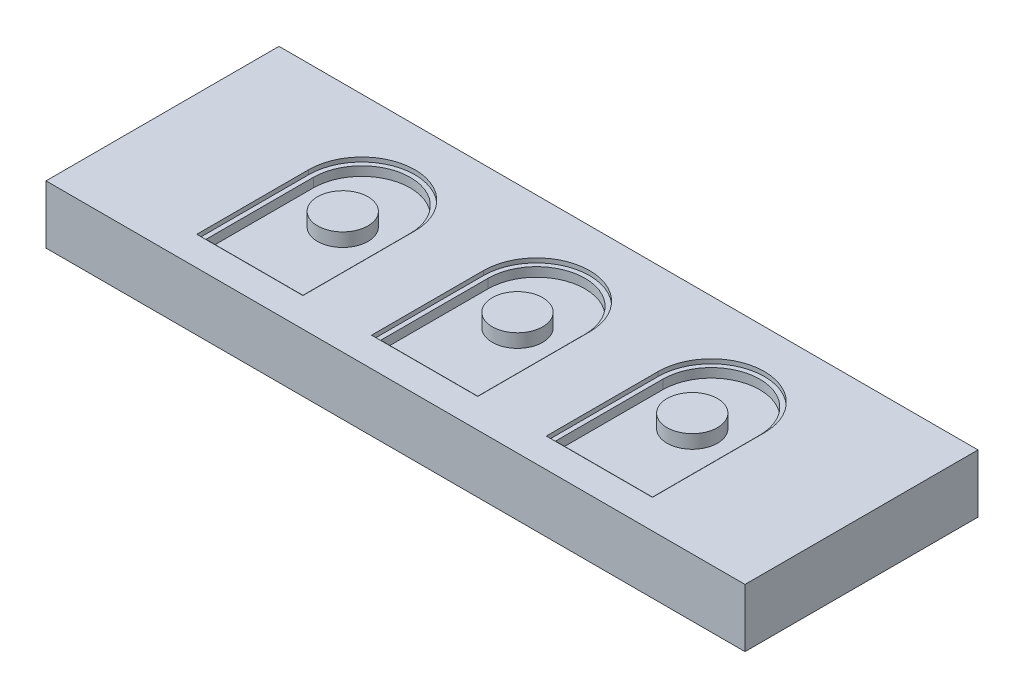
ISO-10303-21;
HEADER;
FILE_DESCRIPTION(('STEP AP214'),'2;1');
FILE_NAME('part.step','',(''),(''),'','','');
FILE_SCHEMA(('AUTOMOTIVE_DESIGN { 1 0 10303 214 1 1 1 1 }'));
ENDSEC;
DATA;
#1=APPLICATION_CONTEXT('core data for automotive mechanical design processes');
#2=APPLICATION_PROTOCOL_DEFINITION('international standard','automotive_design',2000,#1);
#3=PRODUCT_CONTEXT('',#1,'mechanical');
#4=PRODUCT('Part','Part','',(#3));
#5=PRODUCT_RELATED_PRODUCT_CATEGORY('part','',(#4));
#6=PRODUCT_DEFINITION_FORMATION('','',#4);
#7=PRODUCT_DEFINITION_CONTEXT('part definition',#1,'design');
#8=PRODUCT_DEFINITION('design','',#6,#7);
#9=PRODUCT_DEFINITION_SHAPE('','',#8);
#10=(LENGTH_UNIT() NAMED_UNIT(*) SI_UNIT(.MILLI.,.METRE.));
#11=(NAMED_UNIT(*) PLANE_ANGLE_UNIT() SI_UNIT($,.RADIAN.));
#12=(NAMED_UNIT(*) SI_UNIT($,.STERADIAN.) SOLID_ANGLE_UNIT());
#13=UNCERTAINTY_MEASURE_WITH_UNIT(LENGTH_MEASURE(1.E-05),#10,'distance_accuracy_value','');
#14=(GEOMETRIC_REPRESENTATION_CONTEXT(3) GLOBAL_UNCERTAINTY_ASSIGNED_CONTEXT((#13)) GLOBAL_UNIT_ASSIGNED_CONTEXT((#10,
#11,#12)) REPRESENTATION_CONTEXT('',''));
#15=CARTESIAN_POINT('',(0.,0.,0.));
#16=DIRECTION('',(0.,0.,1.));
#17=DIRECTION('',(1.,0.,0.));
#18=AXIS2_PLACEMENT_3D('',#15,#16,#17);
#19=CARTESIAN_POINT('',(0.,12.7,0.));
#20=DIRECTION('',(1.,0.,0.));
#21=DIRECTION('',(0.,0.,-1.));
#22=AXIS2_PLACEMENT_3D('',#19,#20,#21);
#23=PLANE('',#22);
#24=DIRECTION('',(0.,0.,1.));
#25=VECTOR('',#24,1.);
#26=CARTESIAN_POINT('',(0.,0.,0.));
#27=LINE('',#26,#25);
#28=CARTESIAN_POINT('',(0.,0.,-50.8));
#29=VERTEX_POINT('',#28);
#30=CARTESIAN_POINT('',(0.,0.,0.));
#31=VERTEX_POINT('',#30);
#32=EDGE_CURVE('E598',#29,#31,#27,.T.);
#33=ORIENTED_EDGE('',*,*,#32,.T.);
#34=DIRECTION('',(0.,-1.,0.));
#35=VECTOR('',#34,1.);
#36=CARTESIAN_POINT('',(0.,12.7,0.));
#37=LINE('',#36,#35);
#38=CARTESIAN_POINT('',(0.,12.7,0.));
#39=VERTEX_POINT('',#38);
#40=EDGE_CURVE('E12',#39,#31,#37,.T.);
#41=ORIENTED_EDGE('',*,*,#40,.F.);
#42=DIRECTION('',(0.,0.,1.));
#43=VECTOR('',#42,1.);
#44=CARTESIAN_POINT('',(0.,12.7,0.));
#45=LINE('',#44,#43);
#46=CARTESIAN_POINT('',(0.,12.7,-50.8));
#47=VERTEX_POINT('',#46);
#48=EDGE_CURVE('E612',#47,#39,#45,.T.);
#49=ORIENTED_EDGE('',*,*,#48,.F.);
#50=DIRECTION('',(0.,-1.,0.));
#51=VECTOR('',#50,1.);
#52=CARTESIAN_POINT('',(0.,12.7,-50.8));
#53=LINE('',#52,#51);
#54=EDGE_CURVE('E626',#47,#29,#53,.T.);
#55=ORIENTED_EDGE('',*,*,#54,.T.);
#56=EDGE_LOOP('',(#33,#41,#49,#55));
#57=FACE_BOUND('',#56,.T.);
#58=ADVANCED_FACE('F48',(#57),#23,.F.);
#59=CARTESIAN_POINT('',(0.,12.7,0.));
#60=DIRECTION('',(0.,0.,-1.));
#61=DIRECTION('',(-1.,0.,0.));
#62=AXIS2_PLACEMENT_3D('',#59,#60,#61);
#63=PLANE('',#62);
#64=DIRECTION('',(1.,0.,0.));
#65=VECTOR('',#64,1.);
#66=CARTESIAN_POINT('',(0.,0.,0.));
#67=LINE('',#66,#65);
#68=CARTESIAN_POINT('',(152.4,0.,0.));
#69=VERTEX_POINT('',#68);
#70=EDGE_CURVE('E630',#31,#69,#67,.T.);
#71=ORIENTED_EDGE('',*,*,#70,.T.);
#72=DIRECTION('',(0.,-1.,0.));
#73=VECTOR('',#72,1.);
#74=CARTESIAN_POINT('',(152.4,12.7,0.));
#75=LINE('',#74,#73);
#76=CARTESIAN_POINT('',(152.4,12.7,0.));
#77=VERTEX_POINT('',#76);
#78=EDGE_CURVE('E56',#77,#69,#75,.T.);
#79=ORIENTED_EDGE('',*,*,#78,.F.);
#80=DIRECTION('',(1.,0.,0.));
#81=VECTOR('',#80,1.);
#82=CARTESIAN_POINT('',(0.,12.7,0.));
#83=LINE('',#82,#81);
#84=EDGE_CURVE('E616',#39,#77,#83,.T.);
#85=ORIENTED_EDGE('',*,*,#84,.F.);
#86=ORIENTED_EDGE('',*,*,#40,.T.);
#87=EDGE_LOOP('',(#71,#79,#85,#86));
#88=FACE_BOUND('',#87,.T.);
#89=ADVANCED_FACE('F666',(#88),#63,.F.);
#90=CARTESIAN_POINT('',(152.4,12.7,0.));
#91=DIRECTION('',(-1.,0.,0.));
#92=DIRECTION('',(0.,0.,1.));
#93=AXIS2_PLACEMENT_3D('',#90,#91,#92);
#94=PLANE('',#93);
#95=DIRECTION('',(0.,0.,-1.));
#96=VECTOR('',#95,1.);
#97=CARTESIAN_POINT('',(152.4,0.,0.));
#98=LINE('',#97,#96);
#99=CARTESIAN_POINT('',(152.4,0.,-50.8));
#100=VERTEX_POINT('',#99);
#101=EDGE_CURVE('E633',#69,#100,#98,.T.);
#102=ORIENTED_EDGE('',*,*,#101,.T.);
#103=DIRECTION('',(0.,-1.,0.));
#104=VECTOR('',#103,1.);
#105=CARTESIAN_POINT('',(152.4,12.7,-50.8));
#106=LINE('',#105,#104);
#107=CARTESIAN_POINT('',(152.4,12.7,-50.8));
#108=VERTEX_POINT('',#107);
#109=EDGE_CURVE('E641',#108,#100,#106,.T.);
#110=ORIENTED_EDGE('',*,*,#109,.F.);
#111=DIRECTION('',(0.,0.,-1.));
#112=VECTOR('',#111,1.);
#113=CARTESIAN_POINT('',(152.4,12.7,0.));
#114=LINE('',#113,#112);
#115=EDGE_CURVE('E620',#77,#108,#114,.T.);
#116=ORIENTED_EDGE('',*,*,#115,.F.);
#117=ORIENTED_EDGE('',*,*,#78,.T.);
#118=EDGE_LOOP('',(#102,#110,#116,#117));
#119=FACE_BOUND('',#118,.T.);
#120=ADVANCED_FACE('F650',(#119),#94,.F.);
#121=CARTESIAN_POINT('',(0.,12.7,-50.8));
#122=DIRECTION('',(0.,0.,1.));
#123=DIRECTION('',(1.,0.,0.));
#124=AXIS2_PLACEMENT_3D('',#121,#122,#123);
#125=PLANE('',#124);
#126=DIRECTION('',(-1.,0.,0.));
#127=VECTOR('',#126,1.);
#128=CARTESIAN_POINT('',(0.,0.,-50.8));
#129=LINE('',#128,#127);
#130=EDGE_CURVE('E617',#100,#29,#129,.T.);
#131=ORIENTED_EDGE('',*,*,#130,.T.);
#132=ORIENTED_EDGE('',*,*,#54,.F.);
#133=DIRECTION('',(-1.,0.,0.));
#134=VECTOR('',#133,1.);
#135=CARTESIAN_POINT('',(0.,12.7,-50.8));
#136=LINE('',#135,#134);
#137=EDGE_CURVE('E623',#108,#47,#136,.T.);
#138=ORIENTED_EDGE('',*,*,#137,.F.);
#139=ORIENTED_EDGE('',*,*,#109,.T.);
#140=EDGE_LOOP('',(#131,#132,#138,#139));
#141=FACE_BOUND('',#140,.T.);
#142=ADVANCED_FACE('F659',(#141),#125,.F.);
#143=CARTESIAN_POINT('',(0.,12.7,0.));
#144=DIRECTION('',(0.,-1.,0.));
#145=DIRECTION('',(0.,0.,-1.));
#146=AXIS2_PLACEMENT_3D('',#143,#144,#145);
#147=PLANE('',#146);
#148=DIRECTION('',(0.,0.,1.));
#149=VECTOR('',#148,1.);
#150=CARTESIAN_POINT('',(26.526998,12.7,-30.75));
#151=LINE('',#150,#149);
#152=CARTESIAN_POINT('',(26.526998,12.7,-30.75));
#153=VERTEX_POINT('',#152);
#154=CARTESIAN_POINT('',(26.526998,12.7,-6.35));
#155=VERTEX_POINT('',#154);
#156=EDGE_CURVE('E405',#153,#155,#151,.T.);
#157=ORIENTED_EDGE('',*,*,#156,.F.);
#158=CARTESIAN_POINT('',(38.1,12.7,-30.75));
#159=DIRECTION('',(0.,1.,0.));
#160=DIRECTION('',(0.,0.,1.));
#161=AXIS2_PLACEMENT_3D('',#158,#159,#160);
#162=CIRCLE('',#161,11.573002);
#163=CARTESIAN_POINT('',(49.673002,12.7,-30.75));
#164=VERTEX_POINT('',#163);
#165=EDGE_CURVE('E402',#164,#153,#162,.T.);
#166=ORIENTED_EDGE('',*,*,#165,.F.);
#167=DIRECTION('',(0.,0.,-1.));
#168=VECTOR('',#167,1.);
#169=CARTESIAN_POINT('',(49.673002,12.7,-6.35));
#170=LINE('',#169,#168);
#171=CARTESIAN_POINT('',(49.673002,12.7,-6.35));
#172=VERTEX_POINT('',#171);
#173=EDGE_CURVE('E383',#172,#164,#170,.T.);
#174=ORIENTED_EDGE('',*,*,#173,.F.);
#175=DIRECTION('',(1.,0.,0.));
#176=VECTOR('',#175,1.);
#177=CARTESIAN_POINT('',(26.526998,12.7,-6.35));
#178=LINE('',#177,#176);
#179=EDGE_CURVE('E419',#155,#172,#178,.T.);
#180=ORIENTED_EDGE('',*,*,#179,.F.);
#181=EDGE_LOOP('',(#157,#166,#174,#180));
#182=FACE_BOUND('',#181,.T.);
#183=DIRECTION('',(0.,0.,1.));
#184=VECTOR('',#183,1.);
#185=CARTESIAN_POINT('',(102.726998,12.7,-30.75));
#186=LINE('',#185,#184);
#187=CARTESIAN_POINT('',(102.726998,12.7,-30.75));
#188=VERTEX_POINT('',#187);
#189=CARTESIAN_POINT('',(102.726998,12.7,-6.35));
#190=VERTEX_POINT('',#189);
#191=EDGE_CURVE('E469',#188,#190,#186,.T.);
#192=ORIENTED_EDGE('',*,*,#191,.F.);
#193=CARTESIAN_POINT('',(114.3,12.7,-30.75));
#194=DIRECTION('',(0.,1.,0.));
#195=DIRECTION('',(0.,0.,1.));
#196=AXIS2_PLACEMENT_3D('',#193,#194,#195);
#197=CIRCLE('',#196,11.573002);
#198=CARTESIAN_POINT('',(125.873002,12.7,-30.75));
#199=VERTEX_POINT('',#198);
#200=EDGE_CURVE('E303',#199,#188,#197,.T.);
#201=ORIENTED_EDGE('',*,*,#200,.F.);
#202=DIRECTION('',(0.,0.,-1.));
#203=VECTOR('',#202,1.);
#204=CARTESIAN_POINT('',(125.873002,12.7,-6.35));
#205=LINE('',#204,#203);
#206=CARTESIAN_POINT('',(125.873002,12.7,-6.35));
#207=VERTEX_POINT('',#206);
#208=EDGE_CURVE('E448',#207,#199,#205,.T.);
#209=ORIENTED_EDGE('',*,*,#208,.F.);
#210=DIRECTION('',(1.,0.,0.));
#211=VECTOR('',#210,1.);
#212=CARTESIAN_POINT('',(102.726998,12.7,-6.35));
#213=LINE('',#212,#211);
#214=EDGE_CURVE('E481',#190,#207,#213,.T.);
#215=ORIENTED_EDGE('',*,*,#214,.F.);
#216=EDGE_LOOP('',(#192,#201,#209,#215));
#217=FACE_BOUND('',#216,.T.);
#218=DIRECTION('',(0.,0.,1.));
#219=VECTOR('',#218,1.);
#220=CARTESIAN_POINT('',(64.626998,12.7,-30.75));
#221=LINE('',#220,#219);
#222=CARTESIAN_POINT('',(64.626998,12.7,-30.75));
#223=VERTEX_POINT('',#222);
#224=CARTESIAN_POINT('',(64.626998,12.7,-6.35));
#225=VERTEX_POINT('',#224);
#226=EDGE_CURVE('E582',#223,#225,#221,.T.);
#227=ORIENTED_EDGE('',*,*,#226,.F.);
#228=CARTESIAN_POINT('',(76.2,12.7,-30.75));
#229=DIRECTION('',(0.,1.,0.));
#230=DIRECTION('',(0.,0.,1.));
#231=AXIS2_PLACEMENT_3D('',#228,#229,#230);
#232=CIRCLE('',#231,11.573002);
#233=CARTESIAN_POINT('',(87.773002,12.7,-30.75));
#234=VERTEX_POINT('',#233);
#235=EDGE_CURVE('E546',#234,#223,#232,.T.);
#236=ORIENTED_EDGE('',*,*,#235,.F.);
#237=DIRECTION('',(0.,0.,-1.));
#238=VECTOR('',#237,1.);
#239=CARTESIAN_POINT('',(87.773002,12.7,-6.35));
#240=LINE('',#239,#238);
#241=CARTESIAN_POINT('',(87.773002,12.7,-6.35));
#242=VERTEX_POINT('',#241);
#243=EDGE_CURVE('E563',#242,#234,#240,.T.);
#244=ORIENTED_EDGE('',*,*,#243,.F.);
#245=DIRECTION('',(1.,0.,0.));
#246=VECTOR('',#245,1.);
#247=CARTESIAN_POINT('',(64.626998,12.7,-6.35));
#248=LINE('',#247,#246);
#249=EDGE_CURVE('E592',#225,#242,#248,.T.);
#250=ORIENTED_EDGE('',*,*,#249,.F.);
#251=EDGE_LOOP('',(#227,#236,#244,#250));
#252=FACE_BOUND('',#251,.T.);
#253=ORIENTED_EDGE('',*,*,#48,.T.);
#254=ORIENTED_EDGE('',*,*,#84,.T.);
#255=ORIENTED_EDGE('',*,*,#115,.T.);
#256=ORIENTED_EDGE('',*,*,#137,.T.);
#257=EDGE_LOOP('',(#253,#254,#255,#256));
#258=FACE_BOUND('',#257,.T.);
#259=ADVANCED_FACE('F665',(#182,#217,#252,#258),#147,.F.);
#260=CARTESIAN_POINT('',(0.,0.,0.));
#261=DIRECTION('',(0.,-1.,0.));
#262=DIRECTION('',(0.,0.,-1.));
#263=AXIS2_PLACEMENT_3D('',#260,#261,#262);
#264=PLANE('',#263);
#265=ORIENTED_EDGE('',*,*,#32,.F.);
#266=ORIENTED_EDGE('',*,*,#130,.F.);
#267=ORIENTED_EDGE('',*,*,#101,.F.);
#268=ORIENTED_EDGE('',*,*,#70,.F.);
#269=EDGE_LOOP('',(#265,#266,#267,#268));
#270=FACE_BOUND('',#269,.T.);
#271=ADVANCED_FACE('F656',(#270),#264,.T.);
#272=CARTESIAN_POINT('',(76.2,11.75,-30.75));
#273=DIRECTION('',(0.,1.,0.));
#274=DIRECTION('',(0.,0.,1.));
#275=AXIS2_PLACEMENT_3D('',#272,#273,#274);
#276=CYLINDRICAL_SURFACE('',#275,11.573002);
#277=ORIENTED_EDGE('',*,*,#235,.T.);
#278=DIRECTION('',(0.,1.,0.));
#279=VECTOR('',#278,1.);
#280=CARTESIAN_POINT('',(64.626998,11.75,-30.75));
#281=LINE('',#280,#279);
#282=CARTESIAN_POINT('',(64.626998,11.75,-30.75));
#283=VERTEX_POINT('',#282);
#284=EDGE_CURVE('E577',#283,#223,#281,.T.);
#285=ORIENTED_EDGE('',*,*,#284,.F.);
#286=CARTESIAN_POINT('',(76.2,11.75,-30.75));
#287=DIRECTION('',(0.,1.,0.));
#288=DIRECTION('',(0.,0.,1.));
#289=AXIS2_PLACEMENT_3D('',#286,#287,#288);
#290=CIRCLE('',#289,11.573002);
#291=CARTESIAN_POINT('',(87.773002,11.75,-30.75));
#292=VERTEX_POINT('',#291);
#293=EDGE_CURVE('E558',#292,#283,#290,.T.);
#294=ORIENTED_EDGE('',*,*,#293,.F.);
#295=DIRECTION('',(0.,1.,0.));
#296=VECTOR('',#295,1.);
#297=CARTESIAN_POINT('',(87.773002,11.75,-30.75));
#298=LINE('',#297,#296);
#299=EDGE_CURVE('E594',#292,#234,#298,.T.);
#300=ORIENTED_EDGE('',*,*,#299,.T.);
#301=EDGE_LOOP('',(#277,#285,#294,#300));
#302=FACE_BOUND('',#301,.T.);
#303=ADVANCED_FACE('F678',(#302),#276,.F.);
#304=CARTESIAN_POINT('',(87.773002,11.75,-6.35));
#305=DIRECTION('',(1.,0.,0.));
#306=DIRECTION('',(0.,0.,-1.));
#307=AXIS2_PLACEMENT_3D('',#304,#305,#306);
#308=PLANE('',#307);
#309=ORIENTED_EDGE('',*,*,#243,.T.);
#310=ORIENTED_EDGE('',*,*,#299,.F.);
#311=DIRECTION('',(0.,0.,-1.));
#312=VECTOR('',#311,1.);
#313=CARTESIAN_POINT('',(87.773002,11.75,-6.35));
#314=LINE('',#313,#312);
#315=CARTESIAN_POINT('',(87.773002,11.75,-6.35));
#316=VERTEX_POINT('',#315);
#317=EDGE_CURVE('E572',#316,#292,#314,.T.);
#318=ORIENTED_EDGE('',*,*,#317,.F.);
#319=DIRECTION('',(0.,1.,0.));
#320=VECTOR('',#319,1.);
#321=CARTESIAN_POINT('',(87.773002,11.75,-6.35));
#322=LINE('',#321,#320);
#323=EDGE_CURVE('E599',#316,#242,#322,.T.);
#324=ORIENTED_EDGE('',*,*,#323,.T.);
#325=EDGE_LOOP('',(#309,#310,#318,#324));
#326=FACE_BOUND('',#325,.T.);
#327=ADVANCED_FACE('F684',(#326),#308,.F.);
#328=CARTESIAN_POINT('',(64.626998,11.75,-6.35));
#329=DIRECTION('',(0.,0.,1.));
#330=DIRECTION('',(1.,0.,0.));
#331=AXIS2_PLACEMENT_3D('',#328,#329,#330);
#332=PLANE('',#331);
#333=ORIENTED_EDGE('',*,*,#249,.T.);
#334=ORIENTED_EDGE('',*,*,#323,.F.);
#335=DIRECTION('',(1.,0.,0.));
#336=VECTOR('',#335,1.);
#337=CARTESIAN_POINT('',(64.626998,11.75,-6.35));
#338=LINE('',#337,#336);
#339=CARTESIAN_POINT('',(64.626998,11.75,-6.35));
#340=VERTEX_POINT('',#339);
#341=EDGE_CURVE('E578',#340,#316,#338,.T.);
#342=ORIENTED_EDGE('',*,*,#341,.F.);
#343=DIRECTION('',(0.,1.,0.));
#344=VECTOR('',#343,1.);
#345=CARTESIAN_POINT('',(64.626998,11.75,-6.35));
#346=LINE('',#345,#344);
#347=EDGE_CURVE('E605',#340,#225,#346,.T.);
#348=ORIENTED_EDGE('',*,*,#347,.T.);
#349=EDGE_LOOP('',(#333,#334,#342,#348));
#350=FACE_BOUND('',#349,.T.);
#351=ADVANCED_FACE('F690',(#350),#332,.F.);
#352=CARTESIAN_POINT('',(64.626998,11.75,-30.75));
#353=DIRECTION('',(-1.,0.,0.));
#354=DIRECTION('',(0.,0.,1.));
#355=AXIS2_PLACEMENT_3D('',#352,#353,#354);
#356=PLANE('',#355);
#357=ORIENTED_EDGE('',*,*,#226,.T.);
#358=ORIENTED_EDGE('',*,*,#347,.F.);
#359=DIRECTION('',(0.,0.,1.));
#360=VECTOR('',#359,1.);
#361=CARTESIAN_POINT('',(64.626998,11.75,-30.75));
#362=LINE('',#361,#360);
#363=EDGE_CURVE('E562',#283,#340,#362,.T.);
#364=ORIENTED_EDGE('',*,*,#363,.F.);
#365=ORIENTED_EDGE('',*,*,#284,.T.);
#366=EDGE_LOOP('',(#357,#358,#364,#365));
#367=FACE_BOUND('',#366,.T.);
#368=ADVANCED_FACE('F686',(#367),#356,.F.);
#369=CARTESIAN_POINT('',(76.2,11.75,-30.75));
#370=DIRECTION('',(0.,1.,0.));
#371=DIRECTION('',(0.,0.,1.));
#372=AXIS2_PLACEMENT_3D('',#369,#370,#371);
#373=PLANE('',#372);
#374=CARTESIAN_POINT('',(76.2,11.75,-30.75));
#375=DIRECTION('',(0.,1.,0.));
#376=DIRECTION('',(0.,0.,1.));
#377=AXIS2_PLACEMENT_3D('',#374,#375,#376);
#378=CIRCLE('',#377,10.573002);
#379=CARTESIAN_POINT('',(86.773002,11.75,-30.75));
#380=VERTEX_POINT('',#379);
#381=CARTESIAN_POINT('',(65.626998,11.75,-30.75));
#382=VERTEX_POINT('',#381);
#383=EDGE_CURVE('E425',#380,#382,#378,.T.);
#384=ORIENTED_EDGE('',*,*,#383,.F.);
#385=DIRECTION('',(0.,0.,-1.));
#386=VECTOR('',#385,1.);
#387=CARTESIAN_POINT('',(86.773002,11.75,-7.35));
#388=LINE('',#387,#386);
#389=CARTESIAN_POINT('',(86.773002,11.75,-7.35));
#390=VERTEX_POINT('',#389);
#391=EDGE_CURVE('E507',#390,#380,#388,.T.);
#392=ORIENTED_EDGE('',*,*,#391,.F.);
#393=DIRECTION('',(1.,0.,0.));
#394=VECTOR('',#393,1.);
#395=CARTESIAN_POINT('',(65.626998,11.75,-7.35));
#396=LINE('',#395,#394);
#397=CARTESIAN_POINT('',(65.626998,11.75,-7.35));
#398=VERTEX_POINT('',#397);
#399=EDGE_CURVE('E541',#398,#390,#396,.T.);
#400=ORIENTED_EDGE('',*,*,#399,.F.);
#401=DIRECTION('',(0.,0.,1.));
#402=VECTOR('',#401,1.);
#403=CARTESIAN_POINT('',(65.626998,11.75,-30.75));
#404=LINE('',#403,#402);
#405=EDGE_CURVE('E529',#382,#398,#404,.T.);
#406=ORIENTED_EDGE('',*,*,#405,.F.);
#407=EDGE_LOOP('',(#384,#392,#400,#406));
#408=FACE_BOUND('',#407,.T.);
#409=ORIENTED_EDGE('',*,*,#293,.T.);
#410=ORIENTED_EDGE('',*,*,#363,.T.);
#411=ORIENTED_EDGE('',*,*,#341,.T.);
#412=ORIENTED_EDGE('',*,*,#317,.T.);
#413=EDGE_LOOP('',(#409,#410,#411,#412));
#414=FACE_BOUND('',#413,.T.);
#415=ADVANCED_FACE('F689',(#408,#414),#373,.T.);
#416=CARTESIAN_POINT('',(76.2,9.75,-30.75));
#417=DIRECTION('',(0.,1.,0.));
#418=DIRECTION('',(0.,0.,1.));
#419=AXIS2_PLACEMENT_3D('',#416,#417,#418);
#420=CYLINDRICAL_SURFACE('',#419,10.573002);
#421=ORIENTED_EDGE('',*,*,#383,.T.);
#422=DIRECTION('',(0.,1.,0.));
#423=VECTOR('',#422,1.);
#424=CARTESIAN_POINT('',(65.626998,9.75,-30.75));
#425=LINE('',#424,#423);
#426=CARTESIAN_POINT('',(65.626998,9.75,-30.75));
#427=VERTEX_POINT('',#426);
#428=EDGE_CURVE('E523',#427,#382,#425,.T.);
#429=ORIENTED_EDGE('',*,*,#428,.F.);
#430=CARTESIAN_POINT('',(76.2,9.75,-30.75));
#431=DIRECTION('',(0.,1.,0.));
#432=DIRECTION('',(0.,0.,1.));
#433=AXIS2_PLACEMENT_3D('',#430,#431,#432);
#434=CIRCLE('',#433,10.573002);
#435=CARTESIAN_POINT('',(86.773002,9.75,-30.75));
#436=VERTEX_POINT('',#435);
#437=EDGE_CURVE('E501',#436,#427,#434,.T.);
#438=ORIENTED_EDGE('',*,*,#437,.F.);
#439=DIRECTION('',(0.,1.,0.));
#440=VECTOR('',#439,1.);
#441=CARTESIAN_POINT('',(86.773002,9.75,-30.75));
#442=LINE('',#441,#440);
#443=EDGE_CURVE('E543',#436,#380,#442,.T.);
#444=ORIENTED_EDGE('',*,*,#443,.T.);
#445=EDGE_LOOP('',(#421,#429,#438,#444));
#446=FACE_BOUND('',#445,.T.);
#447=ADVANCED_FACE('F700',(#446),#420,.F.);
#448=CARTESIAN_POINT('',(86.773002,9.75,-7.35));
#449=DIRECTION('',(1.,0.,0.));
#450=DIRECTION('',(0.,0.,-1.));
#451=AXIS2_PLACEMENT_3D('',#448,#449,#450);
#452=PLANE('',#451);
#453=ORIENTED_EDGE('',*,*,#391,.T.);
#454=ORIENTED_EDGE('',*,*,#443,.F.);
#455=DIRECTION('',(0.,0.,-1.));
#456=VECTOR('',#455,1.);
#457=CARTESIAN_POINT('',(86.773002,9.75,-7.35));
#458=LINE('',#457,#456);
#459=CARTESIAN_POINT('',(86.773002,9.75,-7.35));
#460=VERTEX_POINT('',#459);
#461=EDGE_CURVE('E518',#460,#436,#458,.T.);
#462=ORIENTED_EDGE('',*,*,#461,.F.);
#463=DIRECTION('',(0.,1.,0.));
#464=VECTOR('',#463,1.);
#465=CARTESIAN_POINT('',(86.773002,9.75,-7.35));
#466=LINE('',#465,#464);
#467=EDGE_CURVE('E547',#460,#390,#466,.T.);
#468=ORIENTED_EDGE('',*,*,#467,.T.);
#469=EDGE_LOOP('',(#453,#454,#462,#468));
#470=FACE_BOUND('',#469,.T.);
#471=ADVANCED_FACE('F704',(#470),#452,.F.);
#472=CARTESIAN_POINT('',(65.626998,9.75,-7.35));
#473=DIRECTION('',(0.,0.,1.));
#474=DIRECTION('',(1.,0.,0.));
#475=AXIS2_PLACEMENT_3D('',#472,#473,#474);
#476=PLANE('',#475);
#477=ORIENTED_EDGE('',*,*,#399,.T.);
#478=ORIENTED_EDGE('',*,*,#467,.F.);
#479=DIRECTION('',(1.,0.,0.));
#480=VECTOR('',#479,1.);
#481=CARTESIAN_POINT('',(65.626998,9.75,-7.35));
#482=LINE('',#481,#480);
#483=CARTESIAN_POINT('',(65.626998,9.75,-7.35));
#484=VERTEX_POINT('',#483);
#485=EDGE_CURVE('E524',#484,#460,#482,.T.);
#486=ORIENTED_EDGE('',*,*,#485,.F.);
#487=DIRECTION('',(0.,1.,0.));
#488=VECTOR('',#487,1.);
#489=CARTESIAN_POINT('',(65.626998,9.75,-7.35));
#490=LINE('',#489,#488);
#491=EDGE_CURVE('E552',#484,#398,#490,.T.);
#492=ORIENTED_EDGE('',*,*,#491,.T.);
#493=EDGE_LOOP('',(#477,#478,#486,#492));
#494=FACE_BOUND('',#493,.T.);
#495=ADVANCED_FACE('F710',(#494),#476,.F.);
#496=CARTESIAN_POINT('',(65.626998,9.75,-30.75));
#497=DIRECTION('',(-1.,0.,0.));
#498=DIRECTION('',(0.,0.,1.));
#499=AXIS2_PLACEMENT_3D('',#496,#497,#498);
#500=PLANE('',#499);
#501=ORIENTED_EDGE('',*,*,#405,.T.);
#502=ORIENTED_EDGE('',*,*,#491,.F.);
#503=DIRECTION('',(0.,0.,1.));
#504=VECTOR('',#503,1.);
#505=CARTESIAN_POINT('',(65.626998,9.75,-30.75));
#506=LINE('',#505,#504);
#507=EDGE_CURVE('E506',#427,#484,#506,.T.);
#508=ORIENTED_EDGE('',*,*,#507,.F.);
#509=ORIENTED_EDGE('',*,*,#428,.T.);
#510=EDGE_LOOP('',(#501,#502,#508,#509));
#511=FACE_BOUND('',#510,.T.);
#512=ADVANCED_FACE('F706',(#511),#500,.F.);
#513=CARTESIAN_POINT('',(76.2,9.75,-30.75));
#514=DIRECTION('',(0.,1.,0.));
#515=DIRECTION('',(0.,0.,1.));
#516=AXIS2_PLACEMENT_3D('',#513,#514,#515);
#517=PLANE('',#516);
#518=CARTESIAN_POINT('',(76.2,9.75,-26.6));
#519=DIRECTION('',(0.,1.,0.));
#520=DIRECTION('',(0.,0.,1.));
#521=AXIS2_PLACEMENT_3D('',#518,#519,#520);
#522=CIRCLE('',#521,5.5);
#523=CARTESIAN_POINT('',(76.2,9.75,-21.1));
#524=VERTEX_POINT('',#523);
#525=EDGE_CURVE('E827',#524,#524,#522,.T.);
#526=ORIENTED_EDGE('',*,*,#525,.F.);
#527=EDGE_LOOP('',(#526));
#528=FACE_BOUND('',#527,.T.);
#529=ORIENTED_EDGE('',*,*,#437,.T.);
#530=ORIENTED_EDGE('',*,*,#507,.T.);
#531=ORIENTED_EDGE('',*,*,#485,.T.);
#532=ORIENTED_EDGE('',*,*,#461,.T.);
#533=EDGE_LOOP('',(#529,#530,#531,#532));
#534=FACE_BOUND('',#533,.T.);
#535=ADVANCED_FACE('F709',(#528,#534),#517,.T.);
#536=CARTESIAN_POINT('',(114.3,11.75,-30.75));
#537=DIRECTION('',(0.,1.,0.));
#538=DIRECTION('',(0.,0.,1.));
#539=AXIS2_PLACEMENT_3D('',#536,#537,#538);
#540=CYLINDRICAL_SURFACE('',#539,11.573002);
#541=ORIENTED_EDGE('',*,*,#200,.T.);
#542=DIRECTION('',(0.,1.,0.));
#543=VECTOR('',#542,1.);
#544=CARTESIAN_POINT('',(102.726998,11.75,-30.75));
#545=LINE('',#544,#543);
#546=CARTESIAN_POINT('',(102.726998,11.75,-30.75));
#547=VERTEX_POINT('',#546);
#548=EDGE_CURVE('E464',#547,#188,#545,.T.);
#549=ORIENTED_EDGE('',*,*,#548,.F.);
#550=CARTESIAN_POINT('',(114.3,11.75,-30.75));
#551=DIRECTION('',(0.,1.,0.));
#552=DIRECTION('',(0.,0.,1.));
#553=AXIS2_PLACEMENT_3D('',#550,#551,#552);
#554=CIRCLE('',#553,11.573002);
#555=CARTESIAN_POINT('',(125.873002,11.75,-30.75));
#556=VERTEX_POINT('',#555);
#557=EDGE_CURVE('E442',#556,#547,#554,.T.);
#558=ORIENTED_EDGE('',*,*,#557,.F.);
#559=DIRECTION('',(0.,1.,0.));
#560=VECTOR('',#559,1.);
#561=CARTESIAN_POINT('',(125.873002,11.75,-30.75));
#562=LINE('',#561,#560);
#563=EDGE_CURVE('E406',#556,#199,#562,.T.);
#564=ORIENTED_EDGE('',*,*,#563,.T.);
#565=EDGE_LOOP('',(#541,#549,#558,#564));
#566=FACE_BOUND('',#565,.T.);
#567=ADVANCED_FACE('F720',(#566),#540,.F.);
#568=CARTESIAN_POINT('',(125.873002,11.75,-6.35));
#569=DIRECTION('',(1.,0.,0.));
#570=DIRECTION('',(0.,0.,-1.));
#571=AXIS2_PLACEMENT_3D('',#568,#569,#570);
#572=PLANE('',#571);
#573=ORIENTED_EDGE('',*,*,#208,.T.);
#574=ORIENTED_EDGE('',*,*,#563,.F.);
#575=DIRECTION('',(0.,0.,-1.));
#576=VECTOR('',#575,1.);
#577=CARTESIAN_POINT('',(125.873002,11.75,-6.35));
#578=LINE('',#577,#576);
#579=CARTESIAN_POINT('',(125.873002,11.75,-6.35));
#580=VERTEX_POINT('',#579);
#581=EDGE_CURVE('E459',#580,#556,#578,.T.);
#582=ORIENTED_EDGE('',*,*,#581,.F.);
#583=DIRECTION('',(0.,1.,0.));
#584=VECTOR('',#583,1.);
#585=CARTESIAN_POINT('',(125.873002,11.75,-6.35));
#586=LINE('',#585,#584);
#587=EDGE_CURVE('E486',#580,#207,#586,.T.);
#588=ORIENTED_EDGE('',*,*,#587,.T.);
#589=EDGE_LOOP('',(#573,#574,#582,#588));
#590=FACE_BOUND('',#589,.T.);
#591=ADVANCED_FACE('F724',(#590),#572,.F.);
#592=CARTESIAN_POINT('',(102.726998,11.75,-6.35));
#593=DIRECTION('',(0.,0.,1.));
#594=DIRECTION('',(1.,0.,0.));
#595=AXIS2_PLACEMENT_3D('',#592,#593,#594);
#596=PLANE('',#595);
#597=ORIENTED_EDGE('',*,*,#214,.T.);
#598=ORIENTED_EDGE('',*,*,#587,.F.);
#599=DIRECTION('',(1.,0.,0.));
#600=VECTOR('',#599,1.);
#601=CARTESIAN_POINT('',(102.726998,11.75,-6.35));
#602=LINE('',#601,#600);
#603=CARTESIAN_POINT('',(102.726998,11.75,-6.35));
#604=VERTEX_POINT('',#603);
#605=EDGE_CURVE('E465',#604,#580,#602,.T.);
#606=ORIENTED_EDGE('',*,*,#605,.F.);
#607=DIRECTION('',(0.,1.,0.));
#608=VECTOR('',#607,1.);
#609=CARTESIAN_POINT('',(102.726998,11.75,-6.35));
#610=LINE('',#609,#608);
#611=EDGE_CURVE('E494',#604,#190,#610,.T.);
#612=ORIENTED_EDGE('',*,*,#611,.T.);
#613=EDGE_LOOP('',(#597,#598,#606,#612));
#614=FACE_BOUND('',#613,.T.);
#615=ADVANCED_FACE('F730',(#614),#596,.F.);
#616=CARTESIAN_POINT('',(102.726998,11.75,-30.75));
#617=DIRECTION('',(-1.,0.,0.));
#618=DIRECTION('',(0.,0.,1.));
#619=AXIS2_PLACEMENT_3D('',#616,#617,#618);
#620=PLANE('',#619);
#621=ORIENTED_EDGE('',*,*,#191,.T.);
#622=ORIENTED_EDGE('',*,*,#611,.F.);
#623=DIRECTION('',(0.,0.,1.));
#624=VECTOR('',#623,1.);
#625=CARTESIAN_POINT('',(102.726998,11.75,-30.75));
#626=LINE('',#625,#624);
#627=EDGE_CURVE('E447',#547,#604,#626,.T.);
#628=ORIENTED_EDGE('',*,*,#627,.F.);
#629=ORIENTED_EDGE('',*,*,#548,.T.);
#630=EDGE_LOOP('',(#621,#622,#628,#629));
#631=FACE_BOUND('',#630,.T.);
#632=ADVANCED_FACE('F726',(#631),#620,.F.);
#633=CARTESIAN_POINT('',(114.3,11.75,-30.75));
#634=DIRECTION('',(0.,1.,0.));
#635=DIRECTION('',(0.,0.,1.));
#636=AXIS2_PLACEMENT_3D('',#633,#634,#635);
#637=PLANE('',#636);
#638=CARTESIAN_POINT('',(114.3,11.75,-30.75));
#639=DIRECTION('',(0.,1.,0.));
#640=DIRECTION('',(0.,0.,1.));
#641=AXIS2_PLACEMENT_3D('',#638,#639,#640);
#642=CIRCLE('',#641,10.573002);
#643=CARTESIAN_POINT('',(124.873002,11.75,-30.75));
#644=VERTEX_POINT('',#643);
#645=CARTESIAN_POINT('',(103.726998,11.75,-30.75));
#646=VERTEX_POINT('',#645);
#647=EDGE_CURVE('E342',#644,#646,#642,.T.);
#648=ORIENTED_EDGE('',*,*,#647,.F.);
#649=DIRECTION('',(0.,0.,-1.));
#650=VECTOR('',#649,1.);
#651=CARTESIAN_POINT('',(124.873002,11.75,-7.35));
#652=LINE('',#651,#650);
#653=CARTESIAN_POINT('',(124.873002,11.75,-7.35));
#654=VERTEX_POINT('',#653);
#655=EDGE_CURVE('E323',#654,#644,#652,.T.);
#656=ORIENTED_EDGE('',*,*,#655,.F.);
#657=DIRECTION('',(1.,0.,0.));
#658=VECTOR('',#657,1.);
#659=CARTESIAN_POINT('',(103.726998,11.75,-7.35));
#660=LINE('',#659,#658);
#661=CARTESIAN_POINT('',(103.726998,11.75,-7.35));
#662=VERTEX_POINT('',#661);
#663=EDGE_CURVE('E63',#662,#654,#660,.T.);
#664=ORIENTED_EDGE('',*,*,#663,.F.);
#665=DIRECTION('',(0.,0.,1.));
#666=VECTOR('',#665,1.);
#667=CARTESIAN_POINT('',(103.726998,11.75,-30.75));
#668=LINE('',#667,#666);
#669=EDGE_CURVE('E346',#646,#662,#668,.T.);
#670=ORIENTED_EDGE('',*,*,#669,.F.);
#671=EDGE_LOOP('',(#648,#656,#664,#670));
#672=FACE_BOUND('',#671,.T.);
#673=ORIENTED_EDGE('',*,*,#557,.T.);
#674=ORIENTED_EDGE('',*,*,#627,.T.);
#675=ORIENTED_EDGE('',*,*,#605,.T.);
#676=ORIENTED_EDGE('',*,*,#581,.T.);
#677=EDGE_LOOP('',(#673,#674,#675,#676));
#678=FACE_BOUND('',#677,.T.);
#679=ADVANCED_FACE('F729',(#672,#678),#637,.T.);
#680=CARTESIAN_POINT('',(38.1,11.75,-30.75));
#681=DIRECTION('',(0.,1.,0.));
#682=DIRECTION('',(0.,0.,1.));
#683=AXIS2_PLACEMENT_3D('',#680,#681,#682);
#684=CYLINDRICAL_SURFACE('',#683,11.573002);
#685=ORIENTED_EDGE('',*,*,#165,.T.);
#686=DIRECTION('',(0.,1.,0.));
#687=VECTOR('',#686,1.);
#688=CARTESIAN_POINT('',(26.526998,11.75,-30.75));
#689=LINE('',#688,#687);
#690=CARTESIAN_POINT('',(26.526998,11.75,-30.75));
#691=VERTEX_POINT('',#690);
#692=EDGE_CURVE('E399',#691,#153,#689,.T.);
#693=ORIENTED_EDGE('',*,*,#692,.F.);
#694=CARTESIAN_POINT('',(38.1,11.75,-30.75));
#695=DIRECTION('',(0.,1.,0.));
#696=DIRECTION('',(0.,0.,1.));
#697=AXIS2_PLACEMENT_3D('',#694,#695,#696);
#698=CIRCLE('',#697,11.573002);
#699=CARTESIAN_POINT('',(49.673002,11.75,-30.75));
#700=VERTEX_POINT('',#699);
#701=EDGE_CURVE('E377',#700,#691,#698,.T.);
#702=ORIENTED_EDGE('',*,*,#701,.F.);
#703=DIRECTION('',(0.,1.,0.));
#704=VECTOR('',#703,1.);
#705=CARTESIAN_POINT('',(49.673002,11.75,-30.75));
#706=LINE('',#705,#704);
#707=EDGE_CURVE('E421',#700,#164,#706,.T.);
#708=ORIENTED_EDGE('',*,*,#707,.T.);
#709=EDGE_LOOP('',(#685,#693,#702,#708));
#710=FACE_BOUND('',#709,.T.);
#711=ADVANCED_FACE('F740',(#710),#684,.F.);
#712=CARTESIAN_POINT('',(49.673002,11.75,-6.35));
#713=DIRECTION('',(1.,0.,0.));
#714=DIRECTION('',(0.,0.,-1.));
#715=AXIS2_PLACEMENT_3D('',#712,#713,#714);
#716=PLANE('',#715);
#717=ORIENTED_EDGE('',*,*,#173,.T.);
#718=ORIENTED_EDGE('',*,*,#707,.F.);
#719=DIRECTION('',(0.,0.,-1.));
#720=VECTOR('',#719,1.);
#721=CARTESIAN_POINT('',(49.673002,11.75,-6.35));
#722=LINE('',#721,#720);
#723=CARTESIAN_POINT('',(49.673002,11.75,-6.35));
#724=VERTEX_POINT('',#723);
#725=EDGE_CURVE('E394',#724,#700,#722,.T.);
#726=ORIENTED_EDGE('',*,*,#725,.F.);
#727=DIRECTION('',(0.,1.,0.));
#728=VECTOR('',#727,1.);
#729=CARTESIAN_POINT('',(49.673002,11.75,-6.35));
#730=LINE('',#729,#728);
#731=EDGE_CURVE('E426',#724,#172,#730,.T.);
#732=ORIENTED_EDGE('',*,*,#731,.T.);
#733=EDGE_LOOP('',(#717,#718,#726,#732));
#734=FACE_BOUND('',#733,.T.);
#735=ADVANCED_FACE('F744',(#734),#716,.F.);
#736=CARTESIAN_POINT('',(26.526998,11.75,-6.35));
#737=DIRECTION('',(0.,0.,1.));
#738=DIRECTION('',(1.,0.,0.));
#739=AXIS2_PLACEMENT_3D('',#736,#737,#738);
#740=PLANE('',#739);
#741=ORIENTED_EDGE('',*,*,#179,.T.);
#742=ORIENTED_EDGE('',*,*,#731,.F.);
#743=DIRECTION('',(1.,0.,0.));
#744=VECTOR('',#743,1.);
#745=CARTESIAN_POINT('',(26.526998,11.75,-6.35));
#746=LINE('',#745,#744);
#747=CARTESIAN_POINT('',(26.526998,11.75,-6.35));
#748=VERTEX_POINT('',#747);
#749=EDGE_CURVE('E400',#748,#724,#746,.T.);
#750=ORIENTED_EDGE('',*,*,#749,.F.);
#751=DIRECTION('',(0.,1.,0.));
#752=VECTOR('',#751,1.);
#753=CARTESIAN_POINT('',(26.526998,11.75,-6.35));
#754=LINE('',#753,#752);
#755=EDGE_CURVE('E435',#748,#155,#754,.T.);
#756=ORIENTED_EDGE('',*,*,#755,.T.);
#757=EDGE_LOOP('',(#741,#742,#750,#756));
#758=FACE_BOUND('',#757,.T.);
#759=ADVANCED_FACE('F750',(#758),#740,.F.);
#760=CARTESIAN_POINT('',(26.526998,11.75,-30.75));
#761=DIRECTION('',(-1.,0.,0.));
#762=DIRECTION('',(0.,0.,1.));
#763=AXIS2_PLACEMENT_3D('',#760,#761,#762);
#764=PLANE('',#763);
#765=ORIENTED_EDGE('',*,*,#156,.T.);
#766=ORIENTED_EDGE('',*,*,#755,.F.);
#767=DIRECTION('',(0.,0.,1.));
#768=VECTOR('',#767,1.);
#769=CARTESIAN_POINT('',(26.526998,11.75,-30.75));
#770=LINE('',#769,#768);
#771=EDGE_CURVE('E382',#691,#748,#770,.T.);
#772=ORIENTED_EDGE('',*,*,#771,.F.);
#773=ORIENTED_EDGE('',*,*,#692,.T.);
#774=EDGE_LOOP('',(#765,#766,#772,#773));
#775=FACE_BOUND('',#774,.T.);
#776=ADVANCED_FACE('F746',(#775),#764,.F.);
#777=CARTESIAN_POINT('',(38.1,11.75,-30.75));
#778=DIRECTION('',(0.,1.,0.));
#779=DIRECTION('',(0.,0.,1.));
#780=AXIS2_PLACEMENT_3D('',#777,#778,#779);
#781=PLANE('',#780);
#782=CARTESIAN_POINT('',(38.1,11.75,-30.75));
#783=DIRECTION('',(0.,1.,0.));
#784=DIRECTION('',(0.,0.,1.));
#785=AXIS2_PLACEMENT_3D('',#782,#783,#784);
#786=CIRCLE('',#785,10.573002);
#787=CARTESIAN_POINT('',(48.673002,11.75,-30.75));
#788=VERTEX_POINT('',#787);
#789=CARTESIAN_POINT('',(27.526998,11.75,-30.75));
#790=VERTEX_POINT('',#789);
#791=EDGE_CURVE('E240',#788,#790,#786,.T.);
#792=ORIENTED_EDGE('',*,*,#791,.F.);
#793=DIRECTION('',(0.,0.,-1.));
#794=VECTOR('',#793,1.);
#795=CARTESIAN_POINT('',(48.673002,11.75,-7.35));
#796=LINE('',#795,#794);
#797=CARTESIAN_POINT('',(48.673002,11.75,-7.35));
#798=VERTEX_POINT('',#797);
#799=EDGE_CURVE('E260',#798,#788,#796,.T.);
#800=ORIENTED_EDGE('',*,*,#799,.F.);
#801=DIRECTION('',(1.,0.,0.));
#802=VECTOR('',#801,1.);
#803=CARTESIAN_POINT('',(27.526998,11.75,-7.35));
#804=LINE('',#803,#802);
#805=CARTESIAN_POINT('',(27.526998,11.75,-7.35));
#806=VERTEX_POINT('',#805);
#807=EDGE_CURVE('E71',#806,#798,#804,.T.);
#808=ORIENTED_EDGE('',*,*,#807,.F.);
#809=DIRECTION('',(0.,0.,1.));
#810=VECTOR('',#809,1.);
#811=CARTESIAN_POINT('',(27.526998,11.75,-30.75));
#812=LINE('',#811,#810);
#813=EDGE_CURVE('E287',#790,#806,#812,.T.);
#814=ORIENTED_EDGE('',*,*,#813,.F.);
#815=EDGE_LOOP('',(#792,#800,#808,#814));
#816=FACE_BOUND('',#815,.T.);
#817=ORIENTED_EDGE('',*,*,#701,.T.);
#818=ORIENTED_EDGE('',*,*,#771,.T.);
#819=ORIENTED_EDGE('',*,*,#749,.T.);
#820=ORIENTED_EDGE('',*,*,#725,.T.);
#821=EDGE_LOOP('',(#817,#818,#819,#820));
#822=FACE_BOUND('',#821,.T.);
#823=ADVANCED_FACE('F749',(#816,#822),#781,.T.);
#824=CARTESIAN_POINT('',(38.1,9.75,-30.75));
#825=DIRECTION('',(0.,1.,0.));
#826=DIRECTION('',(0.,0.,1.));
#827=AXIS2_PLACEMENT_3D('',#824,#825,#826);
#828=CYLINDRICAL_SURFACE('',#827,10.573002);
#829=ORIENTED_EDGE('',*,*,#791,.T.);
#830=DIRECTION('',(0.,1.,0.));
#831=VECTOR('',#830,1.);
#832=CARTESIAN_POINT('',(27.526998,9.75,-30.75));
#833=LINE('',#832,#831);
#834=CARTESIAN_POINT('',(27.526998,9.75,-30.75));
#835=VERTEX_POINT('',#834);
#836=EDGE_CURVE('E233',#835,#790,#833,.T.);
#837=ORIENTED_EDGE('',*,*,#836,.F.);
#838=CARTESIAN_POINT('',(38.1,9.75,-30.75));
#839=DIRECTION('',(0.,1.,0.));
#840=DIRECTION('',(0.,0.,1.));
#841=AXIS2_PLACEMENT_3D('',#838,#839,#840);
#842=CIRCLE('',#841,10.573002);
#843=CARTESIAN_POINT('',(48.673002,9.75,-30.75));
#844=VERTEX_POINT('',#843);
#845=EDGE_CURVE('E237',#844,#835,#842,.T.);
#846=ORIENTED_EDGE('',*,*,#845,.F.);
#847=DIRECTION('',(0.,1.,0.));
#848=VECTOR('',#847,1.);
#849=CARTESIAN_POINT('',(48.673002,9.75,-30.75));
#850=LINE('',#849,#848);
#851=EDGE_CURVE('E299',#844,#788,#850,.T.);
#852=ORIENTED_EDGE('',*,*,#851,.T.);
#853=EDGE_LOOP('',(#829,#837,#846,#852));
#854=FACE_BOUND('',#853,.T.);
#855=ADVANCED_FACE('F235',(#854),#828,.F.);
#856=CARTESIAN_POINT('',(48.673002,9.75,-7.35));
#857=DIRECTION('',(1.,0.,0.));
#858=DIRECTION('',(0.,0.,-1.));
#859=AXIS2_PLACEMENT_3D('',#856,#857,#858);
#860=PLANE('',#859);
#861=ORIENTED_EDGE('',*,*,#799,.T.);
#862=ORIENTED_EDGE('',*,*,#851,.F.);
#863=DIRECTION('',(0.,0.,-1.));
#864=VECTOR('',#863,1.);
#865=CARTESIAN_POINT('',(48.673002,9.75,-7.35));
#866=LINE('',#865,#864);
#867=CARTESIAN_POINT('',(48.673002,9.75,-7.35));
#868=VERTEX_POINT('',#867);
#869=EDGE_CURVE('E246',#868,#844,#866,.T.);
#870=ORIENTED_EDGE('',*,*,#869,.F.);
#871=DIRECTION('',(0.,1.,0.));
#872=VECTOR('',#871,1.);
#873=CARTESIAN_POINT('',(48.673002,9.75,-7.35));
#874=LINE('',#873,#872);
#875=EDGE_CURVE('E304',#868,#798,#874,.T.);
#876=ORIENTED_EDGE('',*,*,#875,.T.);
#877=EDGE_LOOP('',(#861,#862,#870,#876));
#878=FACE_BOUND('',#877,.T.);
#879=ADVANCED_FACE('F783',(#878),#860,.F.);
#880=CARTESIAN_POINT('',(27.526998,9.75,-7.35));
#881=DIRECTION('',(0.,0.,1.));
#882=DIRECTION('',(1.,0.,0.));
#883=AXIS2_PLACEMENT_3D('',#880,#881,#882);
#884=PLANE('',#883);
#885=ORIENTED_EDGE('',*,*,#807,.T.);
#886=ORIENTED_EDGE('',*,*,#875,.F.);
#887=DIRECTION('',(1.,0.,0.));
#888=VECTOR('',#887,1.);
#889=CARTESIAN_POINT('',(27.526998,9.75,-7.35));
#890=LINE('',#889,#888);
#891=CARTESIAN_POINT('',(27.526998,9.75,-7.35));
#892=VERTEX_POINT('',#891);
#893=EDGE_CURVE('E255',#892,#868,#890,.T.);
#894=ORIENTED_EDGE('',*,*,#893,.F.);
#895=DIRECTION('',(0.,1.,0.));
#896=VECTOR('',#895,1.);
#897=CARTESIAN_POINT('',(27.526998,9.75,-7.35));
#898=LINE('',#897,#896);
#899=EDGE_CURVE('E245',#892,#806,#898,.T.);
#900=ORIENTED_EDGE('',*,*,#899,.T.);
#901=EDGE_LOOP('',(#885,#886,#894,#900));
#902=FACE_BOUND('',#901,.T.);
#903=ADVANCED_FACE('F786',(#902),#884,.F.);
#904=CARTESIAN_POINT('',(27.526998,9.75,-30.75));
#905=DIRECTION('',(-1.,0.,0.));
#906=DIRECTION('',(0.,0.,1.));
#907=AXIS2_PLACEMENT_3D('',#904,#905,#906);
#908=PLANE('',#907);
#909=ORIENTED_EDGE('',*,*,#813,.T.);
#910=ORIENTED_EDGE('',*,*,#899,.F.);
#911=DIRECTION('',(0.,0.,1.));
#912=VECTOR('',#911,1.);
#913=CARTESIAN_POINT('',(27.526998,9.75,-30.75));
#914=LINE('',#913,#912);
#915=EDGE_CURVE('E249',#835,#892,#914,.T.);
#916=ORIENTED_EDGE('',*,*,#915,.F.);
#917=ORIENTED_EDGE('',*,*,#836,.T.);
#918=EDGE_LOOP('',(#909,#910,#916,#917));
#919=FACE_BOUND('',#918,.T.);
#920=ADVANCED_FACE('F250',(#919),#908,.F.);
#921=CARTESIAN_POINT('',(38.1,9.75,-30.75));
#922=DIRECTION('',(0.,1.,0.));
#923=DIRECTION('',(0.,0.,1.));
#924=AXIS2_PLACEMENT_3D('',#921,#922,#923);
#925=PLANE('',#924);
#926=CARTESIAN_POINT('',(38.1,9.75,-26.6));
#927=DIRECTION('',(0.,1.,0.));
#928=DIRECTION('',(0.,0.,1.));
#929=AXIS2_PLACEMENT_3D('',#926,#927,#928);
#930=CIRCLE('',#929,5.5);
#931=CARTESIAN_POINT('',(38.1,9.75,-21.1));
#932=VERTEX_POINT('',#931);
#933=EDGE_CURVE('E841',#932,#932,#930,.T.);
#934=ORIENTED_EDGE('',*,*,#933,.F.);
#935=EDGE_LOOP('',(#934));
#936=FACE_BOUND('',#935,.T.);
#937=ORIENTED_EDGE('',*,*,#845,.T.);
#938=ORIENTED_EDGE('',*,*,#915,.T.);
#939=ORIENTED_EDGE('',*,*,#893,.T.);
#940=ORIENTED_EDGE('',*,*,#869,.T.);
#941=EDGE_LOOP('',(#937,#938,#939,#940));
#942=FACE_BOUND('',#941,.T.);
#943=ADVANCED_FACE('F257',(#936,#942),#925,.T.);
#944=CARTESIAN_POINT('',(114.3,9.75,-30.75));
#945=DIRECTION('',(0.,1.,0.));
#946=DIRECTION('',(0.,0.,1.));
#947=AXIS2_PLACEMENT_3D('',#944,#945,#946);
#948=CYLINDRICAL_SURFACE('',#947,10.573002);
#949=ORIENTED_EDGE('',*,*,#647,.T.);
#950=DIRECTION('',(0.,1.,0.));
#951=VECTOR('',#950,1.);
#952=CARTESIAN_POINT('',(103.726998,9.75,-30.75));
#953=LINE('',#952,#951);
#954=CARTESIAN_POINT('',(103.726998,9.75,-30.75));
#955=VERTEX_POINT('',#954);
#956=EDGE_CURVE('E339',#955,#646,#953,.T.);
#957=ORIENTED_EDGE('',*,*,#956,.F.);
#958=CARTESIAN_POINT('',(114.3,9.75,-30.75));
#959=DIRECTION('',(0.,1.,0.));
#960=DIRECTION('',(0.,0.,1.));
#961=AXIS2_PLACEMENT_3D('',#958,#959,#960);
#962=CIRCLE('',#961,10.573002);
#963=CARTESIAN_POINT('',(124.873002,9.75,-30.75));
#964=VERTEX_POINT('',#963);
#965=EDGE_CURVE('E317',#964,#955,#962,.T.);
#966=ORIENTED_EDGE('',*,*,#965,.F.);
#967=DIRECTION('',(0.,1.,0.));
#968=VECTOR('',#967,1.);
#969=CARTESIAN_POINT('',(124.873002,9.75,-30.75));
#970=LINE('',#969,#968);
#971=EDGE_CURVE('E288',#964,#644,#970,.T.);
#972=ORIENTED_EDGE('',*,*,#971,.T.);
#973=EDGE_LOOP('',(#949,#957,#966,#972));
#974=FACE_BOUND('',#973,.T.);
#975=ADVANCED_FACE('F761',(#974),#948,.F.);
#976=CARTESIAN_POINT('',(124.873002,9.75,-7.35));
#977=DIRECTION('',(1.,0.,0.));
#978=DIRECTION('',(0.,0.,-1.));
#979=AXIS2_PLACEMENT_3D('',#976,#977,#978);
#980=PLANE('',#979);
#981=ORIENTED_EDGE('',*,*,#655,.T.);
#982=ORIENTED_EDGE('',*,*,#971,.F.);
#983=DIRECTION('',(0.,0.,-1.));
#984=VECTOR('',#983,1.);
#985=CARTESIAN_POINT('',(124.873002,9.75,-7.35));
#986=LINE('',#985,#984);
#987=CARTESIAN_POINT('',(124.873002,9.75,-7.35));
#988=VERTEX_POINT('',#987);
#989=EDGE_CURVE('E334',#988,#964,#986,.T.);
#990=ORIENTED_EDGE('',*,*,#989,.F.);
#991=DIRECTION('',(0.,1.,0.));
#992=VECTOR('',#991,1.);
#993=CARTESIAN_POINT('',(124.873002,9.75,-7.35));
#994=LINE('',#993,#992);
#995=EDGE_CURVE('E363',#988,#654,#994,.T.);
#996=ORIENTED_EDGE('',*,*,#995,.T.);
#997=EDGE_LOOP('',(#981,#982,#990,#996));
#998=FACE_BOUND('',#997,.T.);
#999=ADVANCED_FACE('F764',(#998),#980,.F.);
#1000=CARTESIAN_POINT('',(103.726998,9.75,-7.35));
#1001=DIRECTION('',(0.,0.,1.));
#1002=DIRECTION('',(1.,0.,0.));
#1003=AXIS2_PLACEMENT_3D('',#1000,#1001,#1002);
#1004=PLANE('',#1003);
#1005=ORIENTED_EDGE('',*,*,#663,.T.);
#1006=ORIENTED_EDGE('',*,*,#995,.F.);
#1007=DIRECTION('',(1.,0.,0.));
#1008=VECTOR('',#1007,1.);
#1009=CARTESIAN_POINT('',(103.726998,9.75,-7.35));
#1010=LINE('',#1009,#1008);
#1011=CARTESIAN_POINT('',(103.726998,9.75,-7.35));
#1012=VERTEX_POINT('',#1011);
#1013=EDGE_CURVE('E340',#1012,#988,#1010,.T.);
#1014=ORIENTED_EDGE('',*,*,#1013,.F.);
#1015=DIRECTION('',(0.,1.,0.));
#1016=VECTOR('',#1015,1.);
#1017=CARTESIAN_POINT('',(103.726998,9.75,-7.35));
#1018=LINE('',#1017,#1016);
#1019=EDGE_CURVE('E371',#1012,#662,#1018,.T.);
#1020=ORIENTED_EDGE('',*,*,#1019,.T.);
#1021=EDGE_LOOP('',(#1005,#1006,#1014,#1020));
#1022=FACE_BOUND('',#1021,.T.);
#1023=ADVANCED_FACE('F770',(#1022),#1004,.F.);
#1024=CARTESIAN_POINT('',(103.726998,9.75,-30.75));
#1025=DIRECTION('',(-1.,0.,0.));
#1026=DIRECTION('',(0.,0.,1.));
#1027=AXIS2_PLACEMENT_3D('',#1024,#1025,#1026);
#1028=PLANE('',#1027);
#1029=ORIENTED_EDGE('',*,*,#669,.T.);
#1030=ORIENTED_EDGE('',*,*,#1019,.F.);
#1031=DIRECTION('',(0.,0.,1.));
#1032=VECTOR('',#1031,1.);
#1033=CARTESIAN_POINT('',(103.726998,9.75,-30.75));
#1034=LINE('',#1033,#1032);
#1035=EDGE_CURVE('E322',#955,#1012,#1034,.T.);
#1036=ORIENTED_EDGE('',*,*,#1035,.F.);
#1037=ORIENTED_EDGE('',*,*,#956,.T.);
#1038=EDGE_LOOP('',(#1029,#1030,#1036,#1037));
#1039=FACE_BOUND('',#1038,.T.);
#1040=ADVANCED_FACE('F766',(#1039),#1028,.F.);
#1041=CARTESIAN_POINT('',(114.3,9.75,-30.75));
#1042=DIRECTION('',(0.,1.,0.));
#1043=DIRECTION('',(0.,0.,1.));
#1044=AXIS2_PLACEMENT_3D('',#1041,#1042,#1043);
#1045=PLANE('',#1044);
#1046=CARTESIAN_POINT('',(114.3,9.75,-26.6));
#1047=DIRECTION('',(0.,1.,0.));
#1048=DIRECTION('',(0.,0.,1.));
#1049=AXIS2_PLACEMENT_3D('',#1046,#1047,#1048);
#1050=CIRCLE('',#1049,5.5);
#1051=CARTESIAN_POINT('',(114.3,9.75,-21.1));
#1052=VERTEX_POINT('',#1051);
#1053=EDGE_CURVE('E826',#1052,#1052,#1050,.T.);
#1054=ORIENTED_EDGE('',*,*,#1053,.F.);
#1055=EDGE_LOOP('',(#1054));
#1056=FACE_BOUND('',#1055,.T.);
#1057=ORIENTED_EDGE('',*,*,#965,.T.);
#1058=ORIENTED_EDGE('',*,*,#1035,.T.);
#1059=ORIENTED_EDGE('',*,*,#1013,.T.);
#1060=ORIENTED_EDGE('',*,*,#989,.T.);
#1061=EDGE_LOOP('',(#1057,#1058,#1059,#1060));
#1062=FACE_BOUND('',#1061,.T.);
#1063=ADVANCED_FACE('F769',(#1056,#1062),#1045,.T.);
#1064=CARTESIAN_POINT('',(38.1,28.2563491861041,-26.6));
#1065=DIRECTION('',(0.,-1.,0.));
#1066=DIRECTION('',(0.,0.,-1.));
#1067=AXIS2_PLACEMENT_3D('',#1064,#1065,#1066);
#1068=CYLINDRICAL_SURFACE('',#1067,5.5);
#1069=CARTESIAN_POINT('',(38.1,12.7,-26.6));
#1070=DIRECTION('',(0.,-1.,0.));
#1071=DIRECTION('',(0.,0.,-1.));
#1072=AXIS2_PLACEMENT_3D('',#1069,#1070,#1071);
#1073=CIRCLE('',#1072,5.5);
#1074=CARTESIAN_POINT('',(38.1,12.7,-32.1));
#1075=VERTEX_POINT('',#1074);
#1076=EDGE_CURVE('E269',#1075,#1075,#1073,.T.);
#1077=ORIENTED_EDGE('',*,*,#1076,.T.);
#1078=EDGE_LOOP('',(#1077));
#1079=FACE_BOUND('',#1078,.T.);
#1080=ORIENTED_EDGE('',*,*,#933,.T.);
#1081=EDGE_LOOP('',(#1080));
#1082=FACE_BOUND('',#1081,.T.);
#1083=ADVANCED_FACE('F779',(#1079,#1082),#1068,.T.);
#1084=CARTESIAN_POINT('',(0.,12.7,0.));
#1085=DIRECTION('',(0.,-1.,0.));
#1086=DIRECTION('',(0.,0.,-1.));
#1087=AXIS2_PLACEMENT_3D('',#1084,#1085,#1086);
#1088=PLANE('',#1087);
#1089=ORIENTED_EDGE('',*,*,#1076,.F.);
#1090=EDGE_LOOP('',(#1089));
#1091=FACE_BOUND('',#1090,.T.);
#1092=ADVANCED_FACE('F797',(#1091),#1088,.F.);
#1093=CARTESIAN_POINT('',(114.3,28.2563491861041,-26.6));
#1094=DIRECTION('',(0.,-1.,0.));
#1095=DIRECTION('',(0.,0.,-1.));
#1096=AXIS2_PLACEMENT_3D('',#1093,#1094,#1095);
#1097=CYLINDRICAL_SURFACE('',#1096,5.5);
#1098=CARTESIAN_POINT('',(114.3,12.7,-26.6));
#1099=DIRECTION('',(0.,-1.,0.));
#1100=DIRECTION('',(0.,0.,-1.));
#1101=AXIS2_PLACEMENT_3D('',#1098,#1099,#1100);
#1102=CIRCLE('',#1101,5.5);
#1103=CARTESIAN_POINT('',(114.3,12.7,-32.1));
#1104=VERTEX_POINT('',#1103);
#1105=EDGE_CURVE('E831',#1104,#1104,#1102,.T.);
#1106=ORIENTED_EDGE('',*,*,#1105,.T.);
#1107=EDGE_LOOP('',(#1106));
#1108=FACE_BOUND('',#1107,.T.);
#1109=ORIENTED_EDGE('',*,*,#1053,.T.);
#1110=EDGE_LOOP('',(#1109));
#1111=FACE_BOUND('',#1110,.T.);
#1112=ADVANCED_FACE('F801',(#1108,#1111),#1097,.T.);
#1113=CARTESIAN_POINT('',(0.,12.7,0.));
#1114=DIRECTION('',(0.,-1.,0.));
#1115=DIRECTION('',(0.,0.,-1.));
#1116=AXIS2_PLACEMENT_3D('',#1113,#1114,#1115);
#1117=PLANE('',#1116);
#1118=ORIENTED_EDGE('',*,*,#1105,.F.);
#1119=EDGE_LOOP('',(#1118));
#1120=FACE_BOUND('',#1119,.T.);
#1121=ADVANCED_FACE('F805',(#1120),#1117,.F.);
#1122=CARTESIAN_POINT('',(76.2,28.2563491861041,-26.6));
#1123=DIRECTION('',(0.,-1.,0.));
#1124=DIRECTION('',(0.,0.,-1.));
#1125=AXIS2_PLACEMENT_3D('',#1122,#1123,#1124);
#1126=CYLINDRICAL_SURFACE('',#1125,5.5);
#1127=CARTESIAN_POINT('',(76.2,12.7,-26.6));
#1128=DIRECTION('',(0.,-1.,0.));
#1129=DIRECTION('',(0.,0.,-1.));
#1130=AXIS2_PLACEMENT_3D('',#1127,#1128,#1129);
#1131=CIRCLE('',#1130,5.5);
#1132=CARTESIAN_POINT('',(76.2,12.7,-32.1));
#1133=VERTEX_POINT('',#1132);
#1134=EDGE_CURVE('E824',#1133,#1133,#1131,.T.);
#1135=ORIENTED_EDGE('',*,*,#1134,.T.);
#1136=EDGE_LOOP('',(#1135));
#1137=FACE_BOUND('',#1136,.T.);
#1138=ORIENTED_EDGE('',*,*,#525,.T.);
#1139=EDGE_LOOP('',(#1138));
#1140=FACE_BOUND('',#1139,.T.);
#1141=ADVANCED_FACE('F809',(#1137,#1140),#1126,.T.);
#1142=CARTESIAN_POINT('',(0.,12.7,0.));
#1143=DIRECTION('',(0.,-1.,0.));
#1144=DIRECTION('',(0.,0.,-1.));
#1145=AXIS2_PLACEMENT_3D('',#1142,#1143,#1144);
#1146=PLANE('',#1145);
#1147=ORIENTED_EDGE('',*,*,#1134,.F.);
#1148=EDGE_LOOP('',(#1147));
#1149=FACE_BOUND('',#1148,.T.);
#1150=ADVANCED_FACE('F813',(#1149),#1146,.F.);
#1151=CLOSED_SHELL('',(#58,#89,#120,#142,#259,#271,#303,#327,#351,#368,#415,#447,#471,#495,#512,
#535,#567,#591,#615,#632,#679,#711,#735,#759,#776,#823,#855,#879,#903,#920,#943,#975,#999,#1023,
#1040,#1063,#1083,#1092,#1112,#1121,#1141,#1150));
#1152=MANIFOLD_SOLID_BREP('B2',#1151);
#1153=ADVANCED_BREP_SHAPE_REPRESENTATION('',(#18,#1152),#14);
#1154=SHAPE_DEFINITION_REPRESENTATION(#9,#1153);
ENDSEC;
END-ISO-10303-21;
